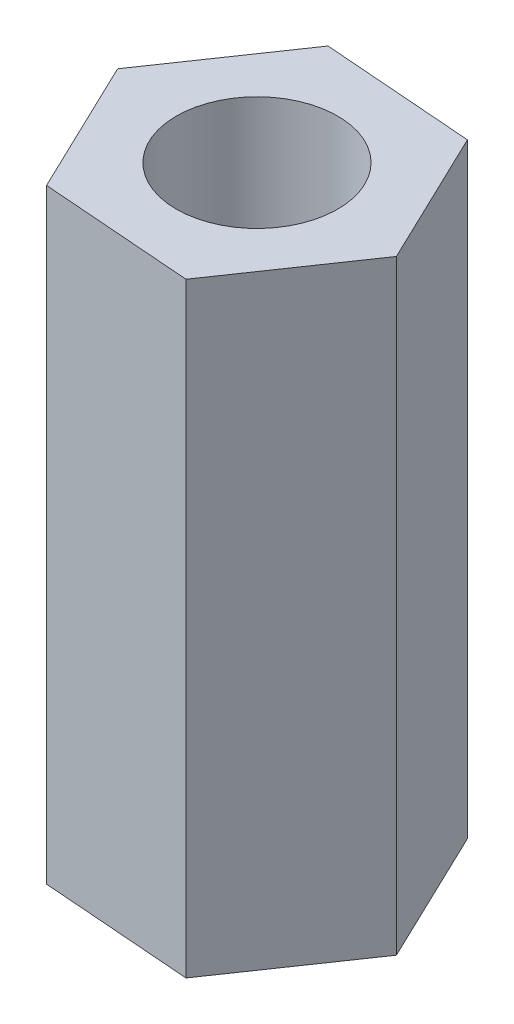
ISO-10303-21;
HEADER;
FILE_DESCRIPTION(('STEP AP214'),'2;1');
FILE_NAME('part.step','',(''),(''),'','','');
FILE_SCHEMA(('AUTOMOTIVE_DESIGN { 1 0 10303 214 1 1 1 1 }'));
ENDSEC;
DATA;
#1=APPLICATION_CONTEXT('core data for automotive mechanical design processes');
#2=APPLICATION_PROTOCOL_DEFINITION('international standard','automotive_design',2000,#1);
#3=PRODUCT_CONTEXT('',#1,'mechanical');
#4=PRODUCT('Part','Part','',(#3));
#5=PRODUCT_RELATED_PRODUCT_CATEGORY('part','',(#4));
#6=PRODUCT_DEFINITION_FORMATION('','',#4);
#7=PRODUCT_DEFINITION_CONTEXT('part definition',#1,'design');
#8=PRODUCT_DEFINITION('design','',#6,#7);
#9=PRODUCT_DEFINITION_SHAPE('','',#8);
#10=(LENGTH_UNIT() NAMED_UNIT(*) SI_UNIT(.MILLI.,.METRE.));
#11=(NAMED_UNIT(*) PLANE_ANGLE_UNIT() SI_UNIT($,.RADIAN.));
#12=(NAMED_UNIT(*) SI_UNIT($,.STERADIAN.) SOLID_ANGLE_UNIT());
#13=UNCERTAINTY_MEASURE_WITH_UNIT(LENGTH_MEASURE(1.E-05),#10,'distance_accuracy_value','');
#14=(GEOMETRIC_REPRESENTATION_CONTEXT(3) GLOBAL_UNCERTAINTY_ASSIGNED_CONTEXT((#13)) GLOBAL_UNIT_ASSIGNED_CONTEXT((#10,
#11,#12)) REPRESENTATION_CONTEXT('',''));
#15=CARTESIAN_POINT('',(0.,0.,0.));
#16=DIRECTION('',(0.,0.,1.));
#17=DIRECTION('',(1.,0.,0.));
#18=AXIS2_PLACEMENT_3D('',#15,#16,#17);
#19=CARTESIAN_POINT('',(0.,12.,0.));
#20=DIRECTION('',(0.,1.,0.));
#21=DIRECTION('',(0.,0.,1.));
#22=AXIS2_PLACEMENT_3D('',#19,#20,#21);
#23=PLANE('',#22);
#24=DIRECTION('',(0.997087277509707,0.,0.0762690043745235));
#25=VECTOR('',#24,1.);
#26=CARTESIAN_POINT('',(-1.69503779237079,12.,2.47793870298845));
#27=LINE('',#26,#25);
#28=CARTESIAN_POINT('',(-1.69503779237079,12.,2.47793870298845));
#29=VERTEX_POINT('',#28);
#30=CARTESIAN_POINT('',(1.29843896962327,12.,2.70691514006202));
#31=VERTEX_POINT('',#30);
#32=EDGE_CURVE('E143',#29,#31,#27,.T.);
#33=ORIENTED_EDGE('',*,*,#32,.T.);
#34=DIRECTION('',(0.564594534064537,0.,-0.825368409926409));
#35=VECTOR('',#34,1.);
#36=CARTESIAN_POINT('',(1.29843896962327,12.,2.70691514006202));
#37=LINE('',#36,#35);
#38=CARTESIAN_POINT('',(2.99347676199406,12.,0.22897643707357));
#39=VERTEX_POINT('',#38);
#40=EDGE_CURVE('E101',#31,#39,#37,.T.);
#41=ORIENTED_EDGE('',*,*,#40,.T.);
#42=DIRECTION('',(-0.43249274344517,0.,-0.901637414300932));
#43=VECTOR('',#42,1.);
#44=CARTESIAN_POINT('',(2.99347676199406,12.,0.22897643707357));
#45=LINE('',#44,#43);
#46=CARTESIAN_POINT('',(1.69503779237079,12.,-2.47793870298845));
#47=VERTEX_POINT('',#46);
#48=EDGE_CURVE('E114',#39,#47,#45,.T.);
#49=ORIENTED_EDGE('',*,*,#48,.T.);
#50=DIRECTION('',(-0.997087277509707,0.,-0.0762690043745234));
#51=VECTOR('',#50,1.);
#52=CARTESIAN_POINT('',(1.69503779237079,12.,-2.47793870298845));
#53=LINE('',#52,#51);
#54=CARTESIAN_POINT('',(-1.29843896962327,12.,-2.70691514006202));
#55=VERTEX_POINT('',#54);
#56=EDGE_CURVE('E108',#47,#55,#53,.T.);
#57=ORIENTED_EDGE('',*,*,#56,.T.);
#58=DIRECTION('',(-0.564594534064537,0.,0.825368409926409));
#59=VECTOR('',#58,1.);
#60=CARTESIAN_POINT('',(-1.29843896962327,12.,-2.70691514006202));
#61=LINE('',#60,#59);
#62=CARTESIAN_POINT('',(-2.99347676199406,12.,-0.228976437073569));
#63=VERTEX_POINT('',#62);
#64=EDGE_CURVE('E112',#55,#63,#61,.T.);
#65=ORIENTED_EDGE('',*,*,#64,.T.);
#66=DIRECTION('',(0.43249274344517,0.,0.901637414300932));
#67=VECTOR('',#66,1.);
#68=CARTESIAN_POINT('',(-2.99347676199406,12.,-0.228976437073569));
#69=LINE('',#68,#67);
#70=EDGE_CURVE('E64',#63,#29,#69,.T.);
#71=ORIENTED_EDGE('',*,*,#70,.T.);
#72=EDGE_LOOP('',(#33,#41,#49,#57,#65,#71));
#73=FACE_BOUND('',#72,.T.);
#74=CARTESIAN_POINT('',(0.,12.,0.));
#75=DIRECTION('',(0.,1.,0.));
#76=DIRECTION('',(0.,0.,1.));
#77=AXIS2_PLACEMENT_3D('',#74,#75,#76);
#78=CIRCLE('',#77,1.6);
#79=CARTESIAN_POINT('',(0.,12.,1.6));
#80=VERTEX_POINT('',#79);
#81=EDGE_CURVE('E136',#80,#80,#78,.T.);
#82=ORIENTED_EDGE('',*,*,#81,.F.);
#83=EDGE_LOOP('',(#82));
#84=FACE_BOUND('',#83,.T.);
#85=ADVANCED_FACE('F47',(#73,#84),#23,.T.);
#86=CARTESIAN_POINT('',(0.,0.,0.));
#87=DIRECTION('',(0.,1.,0.));
#88=DIRECTION('',(0.,0.,1.));
#89=AXIS2_PLACEMENT_3D('',#86,#87,#88);
#90=PLANE('',#89);
#91=DIRECTION('',(0.997087277509707,0.,0.0762690043745235));
#92=VECTOR('',#91,1.);
#93=CARTESIAN_POINT('',(-1.69503779237079,0.,2.47793870298845));
#94=LINE('',#93,#92);
#95=CARTESIAN_POINT('',(-1.69503779237079,0.,2.47793870298845));
#96=VERTEX_POINT('',#95);
#97=CARTESIAN_POINT('',(1.29843896962327,0.,2.70691514006202));
#98=VERTEX_POINT('',#97);
#99=EDGE_CURVE('E132',#96,#98,#94,.T.);
#100=ORIENTED_EDGE('',*,*,#99,.F.);
#101=DIRECTION('',(0.43249274344517,0.,0.901637414300932));
#102=VECTOR('',#101,1.);
#103=CARTESIAN_POINT('',(-2.99347676199406,0.,-0.228976437073569));
#104=LINE('',#103,#102);
#105=CARTESIAN_POINT('',(-2.99347676199406,0.,-0.228976437073569));
#106=VERTEX_POINT('',#105);
#107=EDGE_CURVE('E93',#106,#96,#104,.T.);
#108=ORIENTED_EDGE('',*,*,#107,.F.);
#109=DIRECTION('',(-0.564594534064537,0.,0.825368409926409));
#110=VECTOR('',#109,1.);
#111=CARTESIAN_POINT('',(-1.29843896962327,0.,-2.70691514006202));
#112=LINE('',#111,#110);
#113=CARTESIAN_POINT('',(-1.29843896962327,0.,-2.70691514006202));
#114=VERTEX_POINT('',#113);
#115=EDGE_CURVE('E87',#114,#106,#112,.T.);
#116=ORIENTED_EDGE('',*,*,#115,.F.);
#117=DIRECTION('',(-0.997087277509707,0.,-0.0762690043745234));
#118=VECTOR('',#117,1.);
#119=CARTESIAN_POINT('',(1.69503779237079,0.,-2.47793870298845));
#120=LINE('',#119,#118);
#121=CARTESIAN_POINT('',(1.69503779237079,0.,-2.47793870298845));
#122=VERTEX_POINT('',#121);
#123=EDGE_CURVE('E122',#122,#114,#120,.T.);
#124=ORIENTED_EDGE('',*,*,#123,.F.);
#125=DIRECTION('',(-0.43249274344517,0.,-0.901637414300932));
#126=VECTOR('',#125,1.);
#127=CARTESIAN_POINT('',(2.99347676199406,0.,0.22897643707357));
#128=LINE('',#127,#126);
#129=CARTESIAN_POINT('',(2.99347676199406,0.,0.22897643707357));
#130=VERTEX_POINT('',#129);
#131=EDGE_CURVE('E138',#130,#122,#128,.T.);
#132=ORIENTED_EDGE('',*,*,#131,.F.);
#133=DIRECTION('',(0.564594534064537,0.,-0.825368409926409));
#134=VECTOR('',#133,1.);
#135=CARTESIAN_POINT('',(1.29843896962327,0.,2.70691514006202));
#136=LINE('',#135,#134);
#137=EDGE_CURVE('E135',#98,#130,#136,.T.);
#138=ORIENTED_EDGE('',*,*,#137,.F.);
#139=EDGE_LOOP('',(#100,#108,#116,#124,#132,#138));
#140=FACE_BOUND('',#139,.T.);
#141=CARTESIAN_POINT('',(0.,0.,0.));
#142=DIRECTION('',(0.,1.,0.));
#143=DIRECTION('',(0.,0.,1.));
#144=AXIS2_PLACEMENT_3D('',#141,#142,#143);
#145=CIRCLE('',#144,1.6);
#146=CARTESIAN_POINT('',(0.,0.,1.6));
#147=VERTEX_POINT('',#146);
#148=EDGE_CURVE('E242',#147,#147,#145,.T.);
#149=ORIENTED_EDGE('',*,*,#148,.T.);
#150=EDGE_LOOP('',(#149));
#151=FACE_BOUND('',#150,.T.);
#152=ADVANCED_FACE('F152',(#140,#151),#90,.F.);
#153=CARTESIAN_POINT('',(-1.69503779237079,12.,2.47793870298845));
#154=DIRECTION('',(0.0762690043745235,0.,-0.997087277509707));
#155=DIRECTION('',(-0.997087277509707,0.,-0.0762690043745235));
#156=AXIS2_PLACEMENT_3D('',#153,#154,#155);
#157=PLANE('',#156);
#158=ORIENTED_EDGE('',*,*,#99,.T.);
#159=DIRECTION('',(0.,-1.,0.));
#160=VECTOR('',#159,1.);
#161=CARTESIAN_POINT('',(1.29843896962327,12.,2.70691514006202));
#162=LINE('',#161,#160);
#163=EDGE_CURVE('E11',#31,#98,#162,.T.);
#164=ORIENTED_EDGE('',*,*,#163,.F.);
#165=ORIENTED_EDGE('',*,*,#32,.F.);
#166=DIRECTION('',(0.,-1.,0.));
#167=VECTOR('',#166,1.);
#168=CARTESIAN_POINT('',(-1.69503779237079,12.,2.47793870298845));
#169=LINE('',#168,#167);
#170=EDGE_CURVE('E128',#29,#96,#169,.T.);
#171=ORIENTED_EDGE('',*,*,#170,.T.);
#172=EDGE_LOOP('',(#158,#164,#165,#171));
#173=FACE_BOUND('',#172,.T.);
#174=ADVANCED_FACE('F49',(#173),#157,.F.);
#175=CARTESIAN_POINT('',(1.29843896962327,12.,2.70691514006202));
#176=DIRECTION('',(-0.825368409926409,0.,-0.564594534064537));
#177=DIRECTION('',(-0.564594534064537,0.,0.825368409926409));
#178=AXIS2_PLACEMENT_3D('',#175,#176,#177);
#179=PLANE('',#178);
#180=ORIENTED_EDGE('',*,*,#137,.T.);
#181=DIRECTION('',(0.,-1.,0.));
#182=VECTOR('',#181,1.);
#183=CARTESIAN_POINT('',(2.99347676199406,12.,0.22897643707357));
#184=LINE('',#183,#182);
#185=EDGE_CURVE('E56',#39,#130,#184,.T.);
#186=ORIENTED_EDGE('',*,*,#185,.F.);
#187=ORIENTED_EDGE('',*,*,#40,.F.);
#188=ORIENTED_EDGE('',*,*,#163,.T.);
#189=EDGE_LOOP('',(#180,#186,#187,#188));
#190=FACE_BOUND('',#189,.T.);
#191=ADVANCED_FACE('F177',(#190),#179,.F.);
#192=CARTESIAN_POINT('',(2.99347676199406,12.,0.22897643707357));
#193=DIRECTION('',(-0.901637414300932,0.,0.43249274344517));
#194=DIRECTION('',(0.43249274344517,0.,0.901637414300932));
#195=AXIS2_PLACEMENT_3D('',#192,#193,#194);
#196=PLANE('',#195);
#197=ORIENTED_EDGE('',*,*,#131,.T.);
#198=DIRECTION('',(0.,-1.,0.));
#199=VECTOR('',#198,1.);
#200=CARTESIAN_POINT('',(1.69503779237079,12.,-2.47793870298845));
#201=LINE('',#200,#199);
#202=EDGE_CURVE('E123',#47,#122,#201,.T.);
#203=ORIENTED_EDGE('',*,*,#202,.F.);
#204=ORIENTED_EDGE('',*,*,#48,.F.);
#205=ORIENTED_EDGE('',*,*,#185,.T.);
#206=EDGE_LOOP('',(#197,#203,#204,#205));
#207=FACE_BOUND('',#206,.T.);
#208=ADVANCED_FACE('F149',(#207),#196,.F.);
#209=CARTESIAN_POINT('',(1.69503779237079,12.,-2.47793870298845));
#210=DIRECTION('',(-0.0762690043745234,0.,0.997087277509707));
#211=DIRECTION('',(0.997087277509707,0.,0.0762690043745234));
#212=AXIS2_PLACEMENT_3D('',#209,#210,#211);
#213=PLANE('',#212);
#214=ORIENTED_EDGE('',*,*,#123,.T.);
#215=DIRECTION('',(0.,-1.,0.));
#216=VECTOR('',#215,1.);
#217=CARTESIAN_POINT('',(-1.29843896962327,12.,-2.70691514006202));
#218=LINE('',#217,#216);
#219=EDGE_CURVE('E119',#55,#114,#218,.T.);
#220=ORIENTED_EDGE('',*,*,#219,.F.);
#221=ORIENTED_EDGE('',*,*,#56,.F.);
#222=ORIENTED_EDGE('',*,*,#202,.T.);
#223=EDGE_LOOP('',(#214,#220,#221,#222));
#224=FACE_BOUND('',#223,.T.);
#225=ADVANCED_FACE('F120',(#224),#213,.F.);
#226=CARTESIAN_POINT('',(-1.29843896962327,12.,-2.70691514006202));
#227=DIRECTION('',(0.825368409926409,0.,0.564594534064537));
#228=DIRECTION('',(0.564594534064537,0.,-0.825368409926409));
#229=AXIS2_PLACEMENT_3D('',#226,#227,#228);
#230=PLANE('',#229);
#231=ORIENTED_EDGE('',*,*,#115,.T.);
#232=DIRECTION('',(0.,-1.,0.));
#233=VECTOR('',#232,1.);
#234=CARTESIAN_POINT('',(-2.99347676199406,12.,-0.228976437073569));
#235=LINE('',#234,#233);
#236=EDGE_CURVE('E124',#63,#106,#235,.T.);
#237=ORIENTED_EDGE('',*,*,#236,.F.);
#238=ORIENTED_EDGE('',*,*,#64,.F.);
#239=ORIENTED_EDGE('',*,*,#219,.T.);
#240=EDGE_LOOP('',(#231,#237,#238,#239));
#241=FACE_BOUND('',#240,.T.);
#242=ADVANCED_FACE('F126',(#241),#230,.F.);
#243=CARTESIAN_POINT('',(-2.99347676199406,12.,-0.228976437073569));
#244=DIRECTION('',(0.901637414300932,0.,-0.43249274344517));
#245=DIRECTION('',(-0.43249274344517,0.,-0.901637414300932));
#246=AXIS2_PLACEMENT_3D('',#243,#244,#245);
#247=PLANE('',#246);
#248=ORIENTED_EDGE('',*,*,#107,.T.);
#249=ORIENTED_EDGE('',*,*,#170,.F.);
#250=ORIENTED_EDGE('',*,*,#70,.F.);
#251=ORIENTED_EDGE('',*,*,#236,.T.);
#252=EDGE_LOOP('',(#248,#249,#250,#251));
#253=FACE_BOUND('',#252,.T.);
#254=ADVANCED_FACE('F157',(#253),#247,.F.);
#255=CARTESIAN_POINT('',(0.,12.,0.));
#256=DIRECTION('',(0.,-1.,0.));
#257=DIRECTION('',(0.,0.,-1.));
#258=AXIS2_PLACEMENT_3D('',#255,#256,#257);
#259=CYLINDRICAL_SURFACE('',#258,1.6);
#260=ORIENTED_EDGE('',*,*,#81,.T.);
#261=EDGE_LOOP('',(#260));
#262=FACE_BOUND('',#261,.T.);
#263=ORIENTED_EDGE('',*,*,#148,.F.);
#264=EDGE_LOOP('',(#263));
#265=FACE_BOUND('',#264,.T.);
#266=ADVANCED_FACE('F159',(#262,#265),#259,.F.);
#267=CLOSED_SHELL('',(#85,#152,#174,#191,#208,#225,#242,#254,#266));
#268=MANIFOLD_SOLID_BREP('B2',#267);
#269=ADVANCED_BREP_SHAPE_REPRESENTATION('',(#18,#268),#14);
#270=SHAPE_DEFINITION_REPRESENTATION(#9,#269);
ENDSEC;
END-ISO-10303-21;
